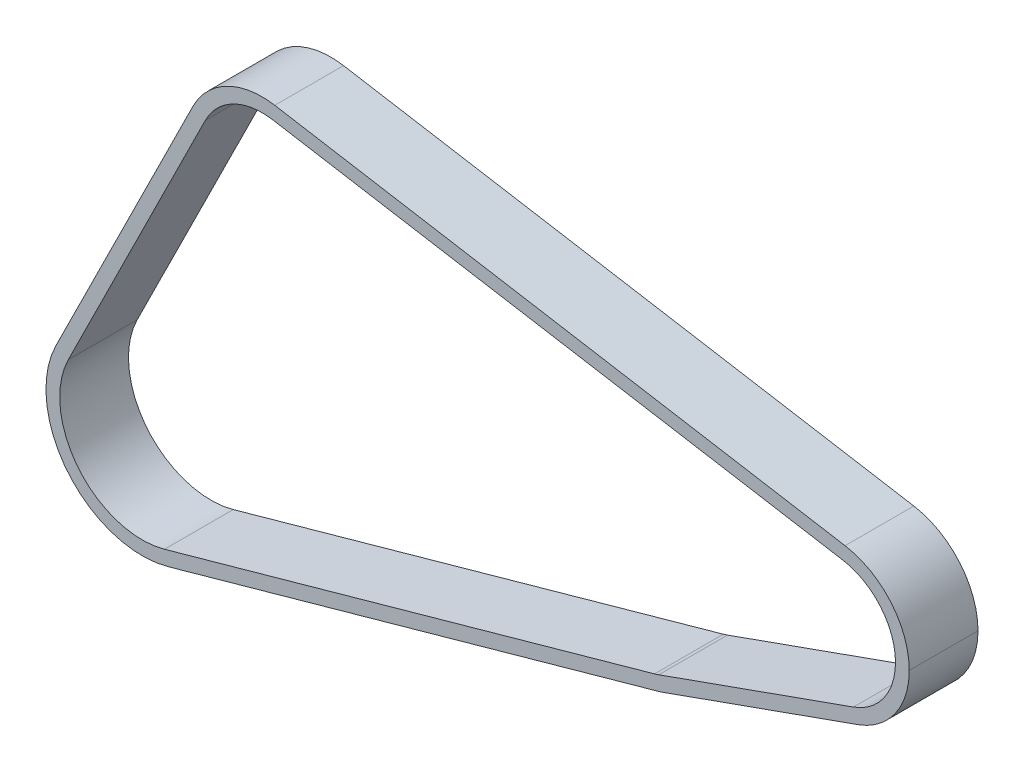
ISO-10303-21;
HEADER;
FILE_DESCRIPTION(('STEP AP214'),'2;1');
FILE_NAME('part.step','',(''),(''),'','','');
FILE_SCHEMA(('AUTOMOTIVE_DESIGN { 1 0 10303 214 1 1 1 1 }'));
ENDSEC;
DATA;
#1=APPLICATION_CONTEXT('core data for automotive mechanical design processes');
#2=APPLICATION_PROTOCOL_DEFINITION('international standard','automotive_design',2000,#1);
#3=PRODUCT_CONTEXT('',#1,'mechanical');
#4=PRODUCT('Part','Part','',(#3));
#5=PRODUCT_RELATED_PRODUCT_CATEGORY('part','',(#4));
#6=PRODUCT_DEFINITION_FORMATION('','',#4);
#7=PRODUCT_DEFINITION_CONTEXT('part definition',#1,'design');
#8=PRODUCT_DEFINITION('design','',#6,#7);
#9=PRODUCT_DEFINITION_SHAPE('','',#8);
#10=(LENGTH_UNIT() NAMED_UNIT(*) SI_UNIT(.MILLI.,.METRE.));
#11=(NAMED_UNIT(*) PLANE_ANGLE_UNIT() SI_UNIT($,.RADIAN.));
#12=(NAMED_UNIT(*) SI_UNIT($,.STERADIAN.) SOLID_ANGLE_UNIT());
#13=UNCERTAINTY_MEASURE_WITH_UNIT(LENGTH_MEASURE(1.E-05),#10,'distance_accuracy_value','');
#14=(GEOMETRIC_REPRESENTATION_CONTEXT(3) GLOBAL_UNCERTAINTY_ASSIGNED_CONTEXT((#13)) GLOBAL_UNIT_ASSIGNED_CONTEXT((#10,
#11,#12)) REPRESENTATION_CONTEXT('',''));
#15=CARTESIAN_POINT('',(0.,0.,0.));
#16=DIRECTION('',(0.,0.,1.));
#17=DIRECTION('',(1.,0.,0.));
#18=AXIS2_PLACEMENT_3D('',#15,#16,#17);
#19=CARTESIAN_POINT('',(0.,0.,-5.));
#20=DIRECTION('',(0.,0.,1.));
#21=DIRECTION('',(1.,0.,0.));
#22=AXIS2_PLACEMENT_3D('',#19,#20,#21);
#23=PLANE('',#22);
#24=DIRECTION('',(-0.986054110783679,0.166425029988302,0.));
#25=VECTOR('',#24,1.);
#26=CARTESIAN_POINT('',(4.39834005462786,26.0597897551538,-5.));
#27=LINE('',#26,#25);
#28=CARTESIAN_POINT('',(50.9393407519115,18.2046554861276,-5.));
#29=VERTEX_POINT('',#28);
#30=CARTESIAN_POINT('',(9.47180111073299,25.2034970840186,-5.));
#31=VERTEX_POINT('',#30);
#32=EDGE_CURVE('E204',#29,#31,#27,.T.);
#33=ORIENTED_EDGE('',*,*,#32,.T.);
#34=CARTESIAN_POINT('',(8.7062459727868,20.6676481744137,-5.));
#35=DIRECTION('',(0.,0.,-1.));
#36=DIRECTION('',(1.,0.,0.));
#37=AXIS2_PLACEMENT_3D('',#34,#35,#36);
#38=CIRCLE('',#37,4.6);
#39=CARTESIAN_POINT('',(4.58676932058386,22.7145756552871,-5.));
#40=VERTEX_POINT('',#39);
#41=EDGE_CURVE('E221',#40,#31,#38,.T.);
#42=ORIENTED_EDGE('',*,*,#41,.F.);
#43=DIRECTION('',(-0.444984234972485,-0.895538402652814,0.));
#44=VECTOR('',#43,1.);
#45=CARTESIAN_POINT('',(-5.37323041591685,2.66990540983489,-5.));
#46=LINE('',#45,#44);
#47=CARTESIAN_POINT('',(-5.37323041591684,2.66990540983491,-5.));
#48=VERTEX_POINT('',#47);
#49=EDGE_CURVE('E220',#40,#48,#46,.T.);
#50=ORIENTED_EDGE('',*,*,#49,.T.);
#51=CARTESIAN_POINT('',(0.,0.,-5.));
#52=DIRECTION('',(0.,0.,-1.));
#53=DIRECTION('',(1.,0.,0.));
#54=AXIS2_PLACEMENT_3D('',#51,#52,#53);
#55=CIRCLE('',#54,6.);
#56=CARTESIAN_POINT('',(1.61652302606672,-5.778135798525,-5.));
#57=VERTEX_POINT('',#56);
#58=EDGE_CURVE('E135',#57,#48,#55,.T.);
#59=ORIENTED_EDGE('',*,*,#58,.F.);
#60=DIRECTION('',(-0.963022633087501,-0.269420504344446,0.));
#61=VECTOR('',#60,1.);
#62=CARTESIAN_POINT('',(1.61652302606667,-5.77813579852501,-5.));
#63=LINE('',#62,#61);
#64=CARTESIAN_POINT('',(37.2521342580761,4.19147864342156,-5.));
#65=VERTEX_POINT('',#64);
#66=EDGE_CURVE('E131',#65,#57,#63,.T.);
#67=ORIENTED_EDGE('',*,*,#66,.F.);
#68=CARTESIAN_POINT('',(36.0127999380917,8.62138275562407,-5.));
#69=DIRECTION('',(0.,0.,-1.));
#70=DIRECTION('',(1.,0.,0.));
#71=AXIS2_PLACEMENT_3D('',#68,#69,#70);
#72=CIRCLE('',#71,4.6);
#73=CARTESIAN_POINT('',(37.5572140973333,4.28839476755695,-5.));
#74=VERTEX_POINT('',#73);
#75=EDGE_CURVE('E120',#74,#65,#72,.T.);
#76=ORIENTED_EDGE('',*,*,#75,.F.);
#77=DIRECTION('',(-0.941953910449372,-0.335742208530795,0.));
#78=VECTOR('',#77,1.);
#79=CARTESIAN_POINT('',(2.87733482885074,-8.07261263208001,-5.));
#80=LINE('',#79,#78);
#81=CARTESIAN_POINT('',(51.718199773207,9.33581858845557,-5.));
#82=VERTEX_POINT('',#81);
#83=EDGE_CURVE('E50',#82,#74,#80,.T.);
#84=ORIENTED_EDGE('',*,*,#83,.F.);
#85=CARTESIAN_POINT('',(50.1737856139653,13.6688065765227,-5.));
#86=DIRECTION('',(0.,0.,-1.));
#87=DIRECTION('',(1.,0.,0.));
#88=AXIS2_PLACEMENT_3D('',#85,#86,#87);
#89=CIRCLE('',#88,4.6);
#90=CARTESIAN_POINT('',(54.7737856139653,13.6688065765227,-5.));
#91=VERTEX_POINT('',#90);
#92=EDGE_CURVE('E192',#91,#82,#89,.T.);
#93=ORIENTED_EDGE('',*,*,#92,.F.);
#94=CARTESIAN_POINT('',(50.1737856139653,13.6688065765227,-5.));
#95=DIRECTION('',(0.,0.,-1.));
#96=DIRECTION('',(1.,0.,0.));
#97=AXIS2_PLACEMENT_3D('',#94,#95,#96);
#98=CIRCLE('',#97,4.6);
#99=EDGE_CURVE('E334',#29,#91,#98,.T.);
#100=ORIENTED_EDGE('',*,*,#99,.F.);
#101=EDGE_LOOP('',(#33,#42,#50,#59,#67,#76,#84,#93,#100));
#102=FACE_BOUND('',#101,.T.);
#103=CARTESIAN_POINT('',(8.7062459727868,20.6676481744137,-5.));
#104=DIRECTION('',(0.,0.,-1.));
#105=DIRECTION('',(1.,0.,0.));
#106=AXIS2_PLACEMENT_3D('',#103,#104,#105);
#107=CIRCLE('',#106,5.6);
#108=CARTESIAN_POINT('',(3.69123091793104,23.1595598902596,-5.));
#109=VERTEX_POINT('',#108);
#110=CARTESIAN_POINT('',(9.63822614072129,26.1895511948023,-5.));
#111=VERTEX_POINT('',#110);
#112=EDGE_CURVE('E285',#109,#111,#107,.T.);
#113=ORIENTED_EDGE('',*,*,#112,.T.);
#114=DIRECTION('',(-0.986054110783679,0.166425029988302,0.));
#115=VECTOR('',#114,1.);
#116=CARTESIAN_POINT('',(4.56476508461616,27.0458438659375,-5.));
#117=LINE('',#116,#115);
#118=CARTESIAN_POINT('',(51.1057657818998,19.1907095969113,-5.));
#119=VERTEX_POINT('',#118);
#120=EDGE_CURVE('E279',#119,#111,#117,.T.);
#121=ORIENTED_EDGE('',*,*,#120,.F.);
#122=CARTESIAN_POINT('',(50.1737856139653,13.6688065765227,-5.));
#123=DIRECTION('',(0.,0.,-1.));
#124=DIRECTION('',(1.,0.,0.));
#125=AXIS2_PLACEMENT_3D('',#122,#123,#124);
#126=CIRCLE('',#125,5.6);
#127=CARTESIAN_POINT('',(55.7737856139653,13.6688065765227,-5.));
#128=VERTEX_POINT('',#127);
#129=EDGE_CURVE('E271',#119,#128,#126,.T.);
#130=ORIENTED_EDGE('',*,*,#129,.T.);
#131=CARTESIAN_POINT('',(50.1737856139653,13.6688065765227,-5.));
#132=DIRECTION('',(0.,0.,-1.));
#133=DIRECTION('',(1.,0.,0.));
#134=AXIS2_PLACEMENT_3D('',#131,#132,#133);
#135=CIRCLE('',#134,5.6);
#136=CARTESIAN_POINT('',(52.0539419817378,8.3938646780062,-5.));
#137=VERTEX_POINT('',#136);
#138=EDGE_CURVE('E304',#128,#137,#135,.T.);
#139=ORIENTED_EDGE('',*,*,#138,.T.);
#140=DIRECTION('',(-0.941953910449373,-0.335742208530795,0.));
#141=VECTOR('',#140,1.);
#142=CARTESIAN_POINT('',(3.21307703738152,-9.01456654252935,-5.));
#143=LINE('',#142,#141);
#144=CARTESIAN_POINT('',(37.8929563058641,3.34644085710759,-5.));
#145=VERTEX_POINT('',#144);
#146=EDGE_CURVE('E263',#137,#145,#143,.T.);
#147=ORIENTED_EDGE('',*,*,#146,.T.);
#148=CARTESIAN_POINT('',(36.0127999380917,8.62138275562407,-5.));
#149=DIRECTION('',(0.,0.,-1.));
#150=DIRECTION('',(1.,0.,0.));
#151=AXIS2_PLACEMENT_3D('',#148,#149,#150);
#152=CIRCLE('',#151,5.6);
#153=CARTESIAN_POINT('',(37.5215547624205,3.22845601033407,-5.));
#154=VERTEX_POINT('',#153);
#155=EDGE_CURVE('E251',#145,#154,#152,.T.);
#156=ORIENTED_EDGE('',*,*,#155,.T.);
#157=DIRECTION('',(-0.963022633087501,-0.269420504344446,0.));
#158=VECTOR('',#157,1.);
#159=CARTESIAN_POINT('',(1.88594353041112,-6.74115843161251,-5.));
#160=LINE('',#159,#158);
#161=CARTESIAN_POINT('',(1.88594353041116,-6.7411584316125,-5.));
#162=VERTEX_POINT('',#161);
#163=EDGE_CURVE('E182',#154,#162,#160,.T.);
#164=ORIENTED_EDGE('',*,*,#163,.T.);
#165=CARTESIAN_POINT('',(0.,0.,-5.));
#166=DIRECTION('',(0.,0.,-1.));
#167=DIRECTION('',(1.,0.,0.));
#168=AXIS2_PLACEMENT_3D('',#165,#166,#167);
#169=CIRCLE('',#168,7.);
#170=CARTESIAN_POINT('',(-6.26876881856966,3.1148896448074,-5.));
#171=VERTEX_POINT('',#170);
#172=EDGE_CURVE('E23',#162,#171,#169,.T.);
#173=ORIENTED_EDGE('',*,*,#172,.T.);
#174=DIRECTION('',(-0.444984234972485,-0.895538402652814,0.));
#175=VECTOR('',#174,1.);
#176=CARTESIAN_POINT('',(-6.26876881856966,3.11488964480737,-5.));
#177=LINE('',#176,#175);
#178=EDGE_CURVE('E294',#109,#171,#177,.T.);
#179=ORIENTED_EDGE('',*,*,#178,.F.);
#180=EDGE_LOOP('',(#113,#121,#130,#139,#147,#156,#164,#173,#179));
#181=FACE_BOUND('',#180,.T.);
#182=ADVANCED_FACE('F15',(#102,#181),#23,.F.);
#183=CARTESIAN_POINT('',(0.,0.,0.));
#184=DIRECTION('',(0.,0.,1.));
#185=DIRECTION('',(1.,0.,0.));
#186=AXIS2_PLACEMENT_3D('',#183,#184,#185);
#187=PLANE('',#186);
#188=CARTESIAN_POINT('',(50.1737856139653,13.6688065765227,0.));
#189=DIRECTION('',(0.,0.,1.));
#190=DIRECTION('',(1.,0.,0.));
#191=AXIS2_PLACEMENT_3D('',#188,#189,#190);
#192=CIRCLE('',#191,4.6);
#193=CARTESIAN_POINT('',(51.718199773207,9.33581858845557,0.));
#194=VERTEX_POINT('',#193);
#195=CARTESIAN_POINT('',(54.7737856139653,13.6688065765227,0.));
#196=VERTEX_POINT('',#195);
#197=EDGE_CURVE('E200',#194,#196,#192,.T.);
#198=ORIENTED_EDGE('',*,*,#197,.F.);
#199=DIRECTION('',(0.941953910449372,0.335742208530795,0.));
#200=VECTOR('',#199,1.);
#201=CARTESIAN_POINT('',(2.87733482885074,-8.07261263208001,0.));
#202=LINE('',#201,#200);
#203=CARTESIAN_POINT('',(37.5572140973333,4.28839476755695,0.));
#204=VERTEX_POINT('',#203);
#205=EDGE_CURVE('E36',#204,#194,#202,.T.);
#206=ORIENTED_EDGE('',*,*,#205,.F.);
#207=CARTESIAN_POINT('',(36.0127999380917,8.62138275562407,0.));
#208=DIRECTION('',(0.,0.,1.));
#209=DIRECTION('',(1.,0.,0.));
#210=AXIS2_PLACEMENT_3D('',#207,#208,#209);
#211=CIRCLE('',#210,4.6);
#212=CARTESIAN_POINT('',(37.2521342580761,4.19147864342156,0.));
#213=VERTEX_POINT('',#212);
#214=EDGE_CURVE('E128',#213,#204,#211,.T.);
#215=ORIENTED_EDGE('',*,*,#214,.F.);
#216=DIRECTION('',(0.963022633087501,0.269420504344446,0.));
#217=VECTOR('',#216,1.);
#218=CARTESIAN_POINT('',(1.61652302606667,-5.77813579852501,0.));
#219=LINE('',#218,#217);
#220=CARTESIAN_POINT('',(1.61652302606672,-5.778135798525,0.));
#221=VERTEX_POINT('',#220);
#222=EDGE_CURVE('E140',#221,#213,#219,.T.);
#223=ORIENTED_EDGE('',*,*,#222,.F.);
#224=CARTESIAN_POINT('',(0.,0.,0.));
#225=DIRECTION('',(0.,0.,1.));
#226=DIRECTION('',(1.,0.,0.));
#227=AXIS2_PLACEMENT_3D('',#224,#225,#226);
#228=CIRCLE('',#227,6.);
#229=CARTESIAN_POINT('',(-5.37323041591684,2.66990540983491,0.));
#230=VERTEX_POINT('',#229);
#231=EDGE_CURVE('E145',#230,#221,#228,.T.);
#232=ORIENTED_EDGE('',*,*,#231,.F.);
#233=DIRECTION('',(0.444984234972485,0.895538402652814,0.));
#234=VECTOR('',#233,1.);
#235=CARTESIAN_POINT('',(-5.37323041591685,2.66990540983489,0.));
#236=LINE('',#235,#234);
#237=CARTESIAN_POINT('',(4.58676932058386,22.7145756552871,0.));
#238=VERTEX_POINT('',#237);
#239=EDGE_CURVE('E227',#230,#238,#236,.T.);
#240=ORIENTED_EDGE('',*,*,#239,.T.);
#241=CARTESIAN_POINT('',(8.7062459727868,20.6676481744137,0.));
#242=DIRECTION('',(0.,0.,1.));
#243=DIRECTION('',(1.,0.,0.));
#244=AXIS2_PLACEMENT_3D('',#241,#242,#243);
#245=CIRCLE('',#244,4.6);
#246=CARTESIAN_POINT('',(9.47180111073299,25.2034970840186,0.));
#247=VERTEX_POINT('',#246);
#248=EDGE_CURVE('E216',#247,#238,#245,.T.);
#249=ORIENTED_EDGE('',*,*,#248,.F.);
#250=DIRECTION('',(0.986054110783679,-0.166425029988302,0.));
#251=VECTOR('',#250,1.);
#252=CARTESIAN_POINT('',(4.39834005462786,26.0597897551538,0.));
#253=LINE('',#252,#251);
#254=CARTESIAN_POINT('',(50.9393407519115,18.2046554861276,0.));
#255=VERTEX_POINT('',#254);
#256=EDGE_CURVE('E207',#247,#255,#253,.T.);
#257=ORIENTED_EDGE('',*,*,#256,.T.);
#258=CARTESIAN_POINT('',(50.1737856139653,13.6688065765227,0.));
#259=DIRECTION('',(0.,0.,1.));
#260=DIRECTION('',(1.,0.,0.));
#261=AXIS2_PLACEMENT_3D('',#258,#259,#260);
#262=CIRCLE('',#261,4.6);
#263=EDGE_CURVE('E316',#196,#255,#262,.T.);
#264=ORIENTED_EDGE('',*,*,#263,.F.);
#265=EDGE_LOOP('',(#198,#206,#215,#223,#232,#240,#249,#257,#264));
#266=FACE_BOUND('',#265,.T.);
#267=DIRECTION('',(0.444984234972484,0.895538402652814,0.));
#268=VECTOR('',#267,1.);
#269=CARTESIAN_POINT('',(-6.26876881856966,3.11488964480737,0.));
#270=LINE('',#269,#268);
#271=CARTESIAN_POINT('',(-6.26876881856965,3.1148896448074,0.));
#272=VERTEX_POINT('',#271);
#273=CARTESIAN_POINT('',(3.69123091793104,23.1595598902596,0.));
#274=VERTEX_POINT('',#273);
#275=EDGE_CURVE('E289',#272,#274,#270,.T.);
#276=ORIENTED_EDGE('',*,*,#275,.F.);
#277=CARTESIAN_POINT('',(0.,0.,0.));
#278=DIRECTION('',(0.,0.,1.));
#279=DIRECTION('',(1.,0.,0.));
#280=AXIS2_PLACEMENT_3D('',#277,#278,#279);
#281=CIRCLE('',#280,7.);
#282=CARTESIAN_POINT('',(1.88594353041116,-6.7411584316125,0.));
#283=VERTEX_POINT('',#282);
#284=EDGE_CURVE('E9',#272,#283,#281,.T.);
#285=ORIENTED_EDGE('',*,*,#284,.T.);
#286=DIRECTION('',(0.963022633087501,0.269420504344446,0.));
#287=VECTOR('',#286,1.);
#288=CARTESIAN_POINT('',(1.88594353041112,-6.74115843161251,0.));
#289=LINE('',#288,#287);
#290=CARTESIAN_POINT('',(37.5215547624205,3.22845601033407,0.));
#291=VERTEX_POINT('',#290);
#292=EDGE_CURVE('E185',#283,#291,#289,.T.);
#293=ORIENTED_EDGE('',*,*,#292,.T.);
#294=CARTESIAN_POINT('',(36.0127999380917,8.62138275562407,0.));
#295=DIRECTION('',(0.,0.,1.));
#296=DIRECTION('',(1.,0.,0.));
#297=AXIS2_PLACEMENT_3D('',#294,#295,#296);
#298=CIRCLE('',#297,5.6);
#299=CARTESIAN_POINT('',(37.8929563058641,3.34644085710759,0.));
#300=VERTEX_POINT('',#299);
#301=EDGE_CURVE('E174',#291,#300,#298,.T.);
#302=ORIENTED_EDGE('',*,*,#301,.T.);
#303=DIRECTION('',(0.941953910449372,0.335742208530795,0.));
#304=VECTOR('',#303,1.);
#305=CARTESIAN_POINT('',(3.21307703738152,-9.01456654252935,0.));
#306=LINE('',#305,#304);
#307=CARTESIAN_POINT('',(52.0539419817378,8.3938646780062,0.));
#308=VERTEX_POINT('',#307);
#309=EDGE_CURVE('E259',#300,#308,#306,.T.);
#310=ORIENTED_EDGE('',*,*,#309,.T.);
#311=CARTESIAN_POINT('',(50.1737856139653,13.6688065765227,0.));
#312=DIRECTION('',(0.,0.,1.));
#313=DIRECTION('',(1.,0.,0.));
#314=AXIS2_PLACEMENT_3D('',#311,#312,#313);
#315=CIRCLE('',#314,5.6);
#316=CARTESIAN_POINT('',(55.7737856139653,13.6688065765227,0.));
#317=VERTEX_POINT('',#316);
#318=EDGE_CURVE('E303',#308,#317,#315,.T.);
#319=ORIENTED_EDGE('',*,*,#318,.T.);
#320=CARTESIAN_POINT('',(50.1737856139653,13.6688065765227,0.));
#321=DIRECTION('',(0.,0.,1.));
#322=DIRECTION('',(1.,0.,0.));
#323=AXIS2_PLACEMENT_3D('',#320,#321,#322);
#324=CIRCLE('',#323,5.6);
#325=CARTESIAN_POINT('',(51.1057657818998,19.1907095969113,0.));
#326=VERTEX_POINT('',#325);
#327=EDGE_CURVE('E267',#317,#326,#324,.T.);
#328=ORIENTED_EDGE('',*,*,#327,.T.);
#329=DIRECTION('',(0.986054110783679,-0.166425029988302,0.));
#330=VECTOR('',#329,1.);
#331=CARTESIAN_POINT('',(4.56476508461616,27.0458438659375,0.));
#332=LINE('',#331,#330);
#333=CARTESIAN_POINT('',(9.63822614072129,26.1895511948023,0.));
#334=VERTEX_POINT('',#333);
#335=EDGE_CURVE('E275',#334,#326,#332,.T.);
#336=ORIENTED_EDGE('',*,*,#335,.F.);
#337=CARTESIAN_POINT('',(8.7062459727868,20.6676481744137,0.));
#338=DIRECTION('',(0.,0.,1.));
#339=DIRECTION('',(1.,0.,0.));
#340=AXIS2_PLACEMENT_3D('',#337,#338,#339);
#341=CIRCLE('',#340,5.6);
#342=EDGE_CURVE('E280',#334,#274,#341,.T.);
#343=ORIENTED_EDGE('',*,*,#342,.T.);
#344=EDGE_LOOP('',(#276,#285,#293,#302,#310,#319,#328,#336,#343));
#345=FACE_BOUND('',#344,.T.);
#346=ADVANCED_FACE('F432',(#266,#345),#187,.T.);
#347=CARTESIAN_POINT('',(0.,0.,-76.0442437876894));
#348=DIRECTION('',(0.,0.,1.));
#349=DIRECTION('',(1.,0.,0.));
#350=AXIS2_PLACEMENT_3D('',#347,#348,#349);
#351=CYLINDRICAL_SURFACE('',#350,7.);
#352=ORIENTED_EDGE('',*,*,#172,.F.);
#353=DIRECTION('',(0.,0.,1.));
#354=VECTOR('',#353,1.);
#355=CARTESIAN_POINT('',(1.88594353041116,-6.7411584316125,-76.0442437876894));
#356=LINE('',#355,#354);
#357=EDGE_CURVE('E188',#162,#283,#356,.T.);
#358=ORIENTED_EDGE('',*,*,#357,.T.);
#359=ORIENTED_EDGE('',*,*,#284,.F.);
#360=DIRECTION('',(0.,0.,1.));
#361=VECTOR('',#360,1.);
#362=CARTESIAN_POINT('',(-6.26876881856965,3.1148896448074,-76.0442437876894));
#363=LINE('',#362,#361);
#364=EDGE_CURVE('E290',#171,#272,#363,.T.);
#365=ORIENTED_EDGE('',*,*,#364,.F.);
#366=EDGE_LOOP('',(#352,#358,#359,#365));
#367=FACE_BOUND('',#366,.T.);
#368=ADVANCED_FACE('F450',(#367),#351,.T.);
#369=CARTESIAN_POINT('',(2.87733482885074,-8.07261263208001,-76.0442437876894));
#370=DIRECTION('',(0.335742208530795,-0.941953910449372,0.));
#371=DIRECTION('',(0.,0.,-1.));
#372=AXIS2_PLACEMENT_3D('',#369,#370,#371);
#373=PLANE('',#372);
#374=DIRECTION('',(0.,0.,1.));
#375=VECTOR('',#374,1.);
#376=CARTESIAN_POINT('',(51.718199773207,9.33581858845557,-76.0442437876894));
#377=LINE('',#376,#375);
#378=EDGE_CURVE('E196',#82,#194,#377,.T.);
#379=ORIENTED_EDGE('',*,*,#378,.F.);
#380=ORIENTED_EDGE('',*,*,#83,.T.);
#381=DIRECTION('',(0.,0.,1.));
#382=VECTOR('',#381,1.);
#383=CARTESIAN_POINT('',(37.5572140973333,4.28839476755695,-76.0442437876894));
#384=LINE('',#383,#382);
#385=EDGE_CURVE('E125',#74,#204,#384,.T.);
#386=ORIENTED_EDGE('',*,*,#385,.T.);
#387=ORIENTED_EDGE('',*,*,#205,.T.);
#388=EDGE_LOOP('',(#379,#380,#386,#387));
#389=FACE_BOUND('',#388,.T.);
#390=ADVANCED_FACE('F448',(#389),#373,.F.);
#391=CARTESIAN_POINT('',(36.0127999380917,8.62138275562407,-76.0442437876894));
#392=DIRECTION('',(0.,0.,1.));
#393=DIRECTION('',(1.,0.,0.));
#394=AXIS2_PLACEMENT_3D('',#391,#392,#393);
#395=CYLINDRICAL_SURFACE('',#394,4.6);
#396=ORIENTED_EDGE('',*,*,#385,.F.);
#397=ORIENTED_EDGE('',*,*,#75,.T.);
#398=DIRECTION('',(0.,0.,1.));
#399=VECTOR('',#398,1.);
#400=CARTESIAN_POINT('',(37.2521342580761,4.19147864342156,-76.0442437876894));
#401=LINE('',#400,#399);
#402=EDGE_CURVE('E124',#65,#213,#401,.T.);
#403=ORIENTED_EDGE('',*,*,#402,.T.);
#404=ORIENTED_EDGE('',*,*,#214,.T.);
#405=EDGE_LOOP('',(#396,#397,#403,#404));
#406=FACE_BOUND('',#405,.T.);
#407=ADVANCED_FACE('F122',(#406),#395,.F.);
#408=CARTESIAN_POINT('',(1.61652302606667,-5.77813579852501,-76.0442437876894));
#409=DIRECTION('',(0.269420504344446,-0.963022633087501,0.));
#410=DIRECTION('',(0.,0.,-1.));
#411=AXIS2_PLACEMENT_3D('',#408,#409,#410);
#412=PLANE('',#411);
#413=ORIENTED_EDGE('',*,*,#402,.F.);
#414=ORIENTED_EDGE('',*,*,#66,.T.);
#415=DIRECTION('',(0.,0.,1.));
#416=VECTOR('',#415,1.);
#417=CARTESIAN_POINT('',(1.61652302606672,-5.778135798525,-76.0442437876894));
#418=LINE('',#417,#416);
#419=EDGE_CURVE('E234',#57,#221,#418,.T.);
#420=ORIENTED_EDGE('',*,*,#419,.T.);
#421=ORIENTED_EDGE('',*,*,#222,.T.);
#422=EDGE_LOOP('',(#413,#414,#420,#421));
#423=FACE_BOUND('',#422,.T.);
#424=ADVANCED_FACE('F143',(#423),#412,.F.);
#425=CARTESIAN_POINT('',(0.,0.,-76.0442437876894));
#426=DIRECTION('',(0.,0.,1.));
#427=DIRECTION('',(1.,0.,0.));
#428=AXIS2_PLACEMENT_3D('',#425,#426,#427);
#429=CYLINDRICAL_SURFACE('',#428,6.);
#430=ORIENTED_EDGE('',*,*,#419,.F.);
#431=ORIENTED_EDGE('',*,*,#58,.T.);
#432=DIRECTION('',(0.,0.,1.));
#433=VECTOR('',#432,1.);
#434=CARTESIAN_POINT('',(-5.37323041591684,2.66990540983491,-76.0442437876894));
#435=LINE('',#434,#433);
#436=EDGE_CURVE('E230',#48,#230,#435,.T.);
#437=ORIENTED_EDGE('',*,*,#436,.T.);
#438=ORIENTED_EDGE('',*,*,#231,.T.);
#439=EDGE_LOOP('',(#430,#431,#437,#438));
#440=FACE_BOUND('',#439,.T.);
#441=ADVANCED_FACE('F241',(#440),#429,.F.);
#442=CARTESIAN_POINT('',(-5.37323041591685,2.66990540983489,-76.0442437876894));
#443=DIRECTION('',(0.895538402652813,-0.444984234972484,0.));
#444=DIRECTION('',(0.,0.,-1.));
#445=AXIS2_PLACEMENT_3D('',#442,#443,#444);
#446=PLANE('',#445);
#447=ORIENTED_EDGE('',*,*,#49,.F.);
#448=DIRECTION('',(0.,0.,1.));
#449=VECTOR('',#448,1.);
#450=CARTESIAN_POINT('',(4.58676932058386,22.7145756552871,-76.0442437876894));
#451=LINE('',#450,#449);
#452=EDGE_CURVE('E215',#40,#238,#451,.T.);
#453=ORIENTED_EDGE('',*,*,#452,.T.);
#454=ORIENTED_EDGE('',*,*,#239,.F.);
#455=ORIENTED_EDGE('',*,*,#436,.F.);
#456=EDGE_LOOP('',(#447,#453,#454,#455));
#457=FACE_BOUND('',#456,.T.);
#458=ADVANCED_FACE('F244',(#457),#446,.T.);
#459=CARTESIAN_POINT('',(8.7062459727868,20.6676481744137,-76.0442437876894));
#460=DIRECTION('',(0.,0.,1.));
#461=DIRECTION('',(1.,0.,0.));
#462=AXIS2_PLACEMENT_3D('',#459,#460,#461);
#463=CYLINDRICAL_SURFACE('',#462,4.6);
#464=ORIENTED_EDGE('',*,*,#452,.F.);
#465=ORIENTED_EDGE('',*,*,#41,.T.);
#466=DIRECTION('',(0.,0.,1.));
#467=VECTOR('',#466,1.);
#468=CARTESIAN_POINT('',(9.47180111073299,25.2034970840186,-76.0442437876894));
#469=LINE('',#468,#467);
#470=EDGE_CURVE('E211',#31,#247,#469,.T.);
#471=ORIENTED_EDGE('',*,*,#470,.T.);
#472=ORIENTED_EDGE('',*,*,#248,.T.);
#473=EDGE_LOOP('',(#464,#465,#471,#472));
#474=FACE_BOUND('',#473,.T.);
#475=ADVANCED_FACE('F447',(#474),#463,.F.);
#476=CARTESIAN_POINT('',(4.39834005462786,26.0597897551538,-76.0442437876894));
#477=DIRECTION('',(-0.166425029988302,-0.986054110783679,0.));
#478=DIRECTION('',(-0.986054110783679,0.166425029988302,0.));
#479=AXIS2_PLACEMENT_3D('',#476,#477,#478);
#480=PLANE('',#479);
#481=ORIENTED_EDGE('',*,*,#32,.F.);
#482=DIRECTION('',(0.,0.,1.));
#483=VECTOR('',#482,1.);
#484=CARTESIAN_POINT('',(50.9393407519115,18.2046554861276,-76.0442437876894));
#485=LINE('',#484,#483);
#486=EDGE_CURVE('E308',#29,#255,#485,.T.);
#487=ORIENTED_EDGE('',*,*,#486,.T.);
#488=ORIENTED_EDGE('',*,*,#256,.F.);
#489=ORIENTED_EDGE('',*,*,#470,.F.);
#490=EDGE_LOOP('',(#481,#487,#488,#489));
#491=FACE_BOUND('',#490,.T.);
#492=ADVANCED_FACE('F445',(#491),#480,.T.);
#493=CARTESIAN_POINT('',(50.1737856139653,13.6688065765227,-76.0442437876894));
#494=DIRECTION('',(0.,0.,1.));
#495=DIRECTION('',(1.,0.,0.));
#496=AXIS2_PLACEMENT_3D('',#493,#494,#495);
#497=CYLINDRICAL_SURFACE('',#496,4.6);
#498=DIRECTION('',(0.,0.,1.));
#499=VECTOR('',#498,1.);
#500=CARTESIAN_POINT('',(54.7737856139653,13.6688065765227,-76.0442437876894));
#501=LINE('',#500,#499);
#502=EDGE_CURVE('E324',#91,#196,#501,.T.);
#503=ORIENTED_EDGE('',*,*,#502,.F.);
#504=ORIENTED_EDGE('',*,*,#92,.T.);
#505=ORIENTED_EDGE('',*,*,#378,.T.);
#506=ORIENTED_EDGE('',*,*,#197,.T.);
#507=EDGE_LOOP('',(#503,#504,#505,#506));
#508=FACE_BOUND('',#507,.T.);
#509=ADVANCED_FACE('F431',(#508),#497,.F.);
#510=CARTESIAN_POINT('',(1.88594353041112,-6.74115843161251,-76.0442437876894));
#511=DIRECTION('',(0.269420504344446,-0.963022633087501,0.));
#512=DIRECTION('',(0.,0.,-1.));
#513=AXIS2_PLACEMENT_3D('',#510,#511,#512);
#514=PLANE('',#513);
#515=ORIENTED_EDGE('',*,*,#163,.F.);
#516=DIRECTION('',(0.,0.,1.));
#517=VECTOR('',#516,1.);
#518=CARTESIAN_POINT('',(37.5215547624205,3.22845601033407,-76.0442437876894));
#519=LINE('',#518,#517);
#520=EDGE_CURVE('E178',#154,#291,#519,.T.);
#521=ORIENTED_EDGE('',*,*,#520,.T.);
#522=ORIENTED_EDGE('',*,*,#292,.F.);
#523=ORIENTED_EDGE('',*,*,#357,.F.);
#524=EDGE_LOOP('',(#515,#521,#522,#523));
#525=FACE_BOUND('',#524,.T.);
#526=ADVANCED_FACE('F496',(#525),#514,.T.);
#527=CARTESIAN_POINT('',(36.0127999380917,8.62138275562407,-76.0442437876894));
#528=DIRECTION('',(0.,0.,1.));
#529=DIRECTION('',(1.,0.,0.));
#530=AXIS2_PLACEMENT_3D('',#527,#528,#529);
#531=CYLINDRICAL_SURFACE('',#530,5.6);
#532=ORIENTED_EDGE('',*,*,#155,.F.);
#533=DIRECTION('',(0.,0.,1.));
#534=VECTOR('',#533,1.);
#535=CARTESIAN_POINT('',(37.8929563058641,3.34644085710759,-76.0442437876894));
#536=LINE('',#535,#534);
#537=EDGE_CURVE('E255',#145,#300,#536,.T.);
#538=ORIENTED_EDGE('',*,*,#537,.T.);
#539=ORIENTED_EDGE('',*,*,#301,.F.);
#540=ORIENTED_EDGE('',*,*,#520,.F.);
#541=EDGE_LOOP('',(#532,#538,#539,#540));
#542=FACE_BOUND('',#541,.T.);
#543=ADVANCED_FACE('F494',(#542),#531,.T.);
#544=CARTESIAN_POINT('',(3.21307703738152,-9.01456654252935,-76.0442437876894));
#545=DIRECTION('',(0.335742208530795,-0.941953910449373,0.));
#546=DIRECTION('',(0.,0.,-1.));
#547=AXIS2_PLACEMENT_3D('',#544,#545,#546);
#548=PLANE('',#547);
#549=ORIENTED_EDGE('',*,*,#146,.F.);
#550=DIRECTION('',(0.,0.,1.));
#551=VECTOR('',#550,1.);
#552=CARTESIAN_POINT('',(52.0539419817378,8.3938646780062,-76.0442437876894));
#553=LINE('',#552,#551);
#554=EDGE_CURVE('E309',#137,#308,#553,.T.);
#555=ORIENTED_EDGE('',*,*,#554,.T.);
#556=ORIENTED_EDGE('',*,*,#309,.F.);
#557=ORIENTED_EDGE('',*,*,#537,.F.);
#558=EDGE_LOOP('',(#549,#555,#556,#557));
#559=FACE_BOUND('',#558,.T.);
#560=ADVANCED_FACE('F480',(#559),#548,.T.);
#561=CARTESIAN_POINT('',(50.1737856139653,13.6688065765227,-76.0442437876894));
#562=DIRECTION('',(0.,0.,1.));
#563=DIRECTION('',(1.,0.,0.));
#564=AXIS2_PLACEMENT_3D('',#561,#562,#563);
#565=CYLINDRICAL_SURFACE('',#564,5.6);
#566=DIRECTION('',(0.,0.,1.));
#567=VECTOR('',#566,1.);
#568=CARTESIAN_POINT('',(55.7737856139653,13.6688065765227,-76.0442437876894));
#569=LINE('',#568,#567);
#570=EDGE_CURVE('E299',#128,#317,#569,.T.);
#571=ORIENTED_EDGE('',*,*,#570,.F.);
#572=ORIENTED_EDGE('',*,*,#129,.F.);
#573=DIRECTION('',(0.,0.,1.));
#574=VECTOR('',#573,1.);
#575=CARTESIAN_POINT('',(51.1057657818998,19.1907095969113,-76.0442437876894));
#576=LINE('',#575,#574);
#577=EDGE_CURVE('E320',#119,#326,#576,.T.);
#578=ORIENTED_EDGE('',*,*,#577,.T.);
#579=ORIENTED_EDGE('',*,*,#327,.F.);
#580=EDGE_LOOP('',(#571,#572,#578,#579));
#581=FACE_BOUND('',#580,.T.);
#582=ADVANCED_FACE('F476',(#581),#565,.T.);
#583=CARTESIAN_POINT('',(4.56476508461616,27.0458438659375,-76.0442437876894));
#584=DIRECTION('',(-0.166425029988302,-0.986054110783679,0.));
#585=DIRECTION('',(-0.986054110783679,0.166425029988302,0.));
#586=AXIS2_PLACEMENT_3D('',#583,#584,#585);
#587=PLANE('',#586);
#588=ORIENTED_EDGE('',*,*,#577,.F.);
#589=ORIENTED_EDGE('',*,*,#120,.T.);
#590=DIRECTION('',(0.,0.,1.));
#591=VECTOR('',#590,1.);
#592=CARTESIAN_POINT('',(9.63822614072129,26.1895511948023,-76.0442437876894));
#593=LINE('',#592,#591);
#594=EDGE_CURVE('E284',#111,#334,#593,.T.);
#595=ORIENTED_EDGE('',*,*,#594,.T.);
#596=ORIENTED_EDGE('',*,*,#335,.T.);
#597=EDGE_LOOP('',(#588,#589,#595,#596));
#598=FACE_BOUND('',#597,.T.);
#599=ADVANCED_FACE('F479',(#598),#587,.F.);
#600=CARTESIAN_POINT('',(8.7062459727868,20.6676481744137,-76.0442437876894));
#601=DIRECTION('',(0.,0.,1.));
#602=DIRECTION('',(1.,0.,0.));
#603=AXIS2_PLACEMENT_3D('',#600,#601,#602);
#604=CYLINDRICAL_SURFACE('',#603,5.6);
#605=ORIENTED_EDGE('',*,*,#112,.F.);
#606=DIRECTION('',(0.,0.,1.));
#607=VECTOR('',#606,1.);
#608=CARTESIAN_POINT('',(3.69123091793104,23.1595598902596,-76.0442437876894));
#609=LINE('',#608,#607);
#610=EDGE_CURVE('E298',#109,#274,#609,.T.);
#611=ORIENTED_EDGE('',*,*,#610,.T.);
#612=ORIENTED_EDGE('',*,*,#342,.F.);
#613=ORIENTED_EDGE('',*,*,#594,.F.);
#614=EDGE_LOOP('',(#605,#611,#612,#613));
#615=FACE_BOUND('',#614,.T.);
#616=ADVANCED_FACE('F353',(#615),#604,.T.);
#617=CARTESIAN_POINT('',(-6.26876881856966,3.11488964480737,-76.0442437876894));
#618=DIRECTION('',(0.895538402652813,-0.444984234972484,0.));
#619=DIRECTION('',(0.,0.,-1.));
#620=AXIS2_PLACEMENT_3D('',#617,#618,#619);
#621=PLANE('',#620);
#622=ORIENTED_EDGE('',*,*,#610,.F.);
#623=ORIENTED_EDGE('',*,*,#178,.T.);
#624=ORIENTED_EDGE('',*,*,#364,.T.);
#625=ORIENTED_EDGE('',*,*,#275,.T.);
#626=EDGE_LOOP('',(#622,#623,#624,#625));
#627=FACE_BOUND('',#626,.T.);
#628=ADVANCED_FACE('F360',(#627),#621,.F.);
#629=CARTESIAN_POINT('',(50.1737856139653,13.6688065765227,-76.0442437876894));
#630=DIRECTION('',(0.,0.,1.));
#631=DIRECTION('',(1.,0.,0.));
#632=AXIS2_PLACEMENT_3D('',#629,#630,#631);
#633=CYLINDRICAL_SURFACE('',#632,5.6);
#634=ORIENTED_EDGE('',*,*,#138,.F.);
#635=ORIENTED_EDGE('',*,*,#570,.T.);
#636=ORIENTED_EDGE('',*,*,#318,.F.);
#637=ORIENTED_EDGE('',*,*,#554,.F.);
#638=EDGE_LOOP('',(#634,#635,#636,#637));
#639=FACE_BOUND('',#638,.T.);
#640=ADVANCED_FACE('F470',(#639),#633,.T.);
#641=CARTESIAN_POINT('',(50.1737856139653,13.6688065765227,-76.0442437876894));
#642=DIRECTION('',(0.,0.,1.));
#643=DIRECTION('',(1.,0.,0.));
#644=AXIS2_PLACEMENT_3D('',#641,#642,#643);
#645=CYLINDRICAL_SURFACE('',#644,4.6);
#646=ORIENTED_EDGE('',*,*,#99,.T.);
#647=ORIENTED_EDGE('',*,*,#502,.T.);
#648=ORIENTED_EDGE('',*,*,#263,.T.);
#649=ORIENTED_EDGE('',*,*,#486,.F.);
#650=EDGE_LOOP('',(#646,#647,#648,#649));
#651=FACE_BOUND('',#650,.T.);
#652=ADVANCED_FACE('F436',(#651),#645,.F.);
#653=CLOSED_SHELL('',(#182,#346,#368,#390,#407,#424,#441,#458,#475,#492,#509,#526,#543,#560,
#582,#599,#616,#628,#640,#652));
#654=MANIFOLD_SOLID_BREP('B1',#653);
#655=ADVANCED_BREP_SHAPE_REPRESENTATION('',(#18,#654),#14);
#656=SHAPE_DEFINITION_REPRESENTATION(#9,#655);
ENDSEC;
END-ISO-10303-21;
